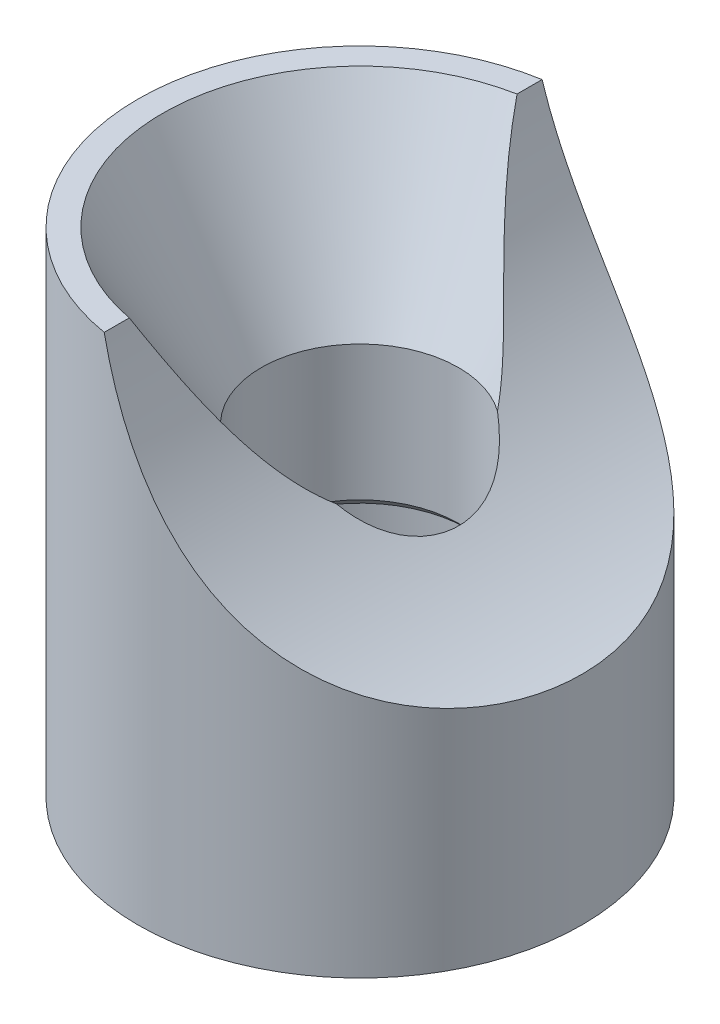
ISO-10303-21;
HEADER;
FILE_DESCRIPTION(('STEP AP214'),'2;1');
FILE_NAME('part.step','',(''),(''),'','','');
FILE_SCHEMA(('AUTOMOTIVE_DESIGN { 1 0 10303 214 1 1 1 1 }'));
ENDSEC;
DATA;
#1=APPLICATION_CONTEXT('core data for automotive mechanical design processes');
#2=APPLICATION_PROTOCOL_DEFINITION('international standard','automotive_design',2000,#1);
#3=PRODUCT_CONTEXT('',#1,'mechanical');
#4=PRODUCT('Part','Part','',(#3));
#5=PRODUCT_RELATED_PRODUCT_CATEGORY('part','',(#4));
#6=PRODUCT_DEFINITION_FORMATION('','',#4);
#7=PRODUCT_DEFINITION_CONTEXT('part definition',#1,'design');
#8=PRODUCT_DEFINITION('design','',#6,#7);
#9=PRODUCT_DEFINITION_SHAPE('','',#8);
#10=(LENGTH_UNIT() NAMED_UNIT(*) SI_UNIT(.MILLI.,.METRE.));
#11=(NAMED_UNIT(*) PLANE_ANGLE_UNIT() SI_UNIT($,.RADIAN.));
#12=(NAMED_UNIT(*) SI_UNIT($,.STERADIAN.) SOLID_ANGLE_UNIT());
#13=UNCERTAINTY_MEASURE_WITH_UNIT(LENGTH_MEASURE(1.E-05),#10,'distance_accuracy_value','');
#14=(GEOMETRIC_REPRESENTATION_CONTEXT(3) GLOBAL_UNCERTAINTY_ASSIGNED_CONTEXT((#13)) GLOBAL_UNIT_ASSIGNED_CONTEXT((#10,
#11,#12)) REPRESENTATION_CONTEXT('',''));
#15=CARTESIAN_POINT('',(0.,0.,0.));
#16=DIRECTION('',(0.,0.,1.));
#17=DIRECTION('',(1.,0.,0.));
#18=AXIS2_PLACEMENT_3D('',#15,#16,#17);
#19=CARTESIAN_POINT('',(0.,10.,0.));
#20=DIRECTION('',(0.,-1.,0.));
#21=DIRECTION('',(0.,0.,-1.));
#22=AXIS2_PLACEMENT_3D('',#19,#20,#21);
#23=CYLINDRICAL_SURFACE('',#22,2.);
#24=CARTESIAN_POINT('',(0.,3.8,0.));
#25=DIRECTION('',(0.,-1.,0.));
#26=DIRECTION('',(0.,0.,-1.));
#27=AXIS2_PLACEMENT_3D('',#24,#25,#26);
#28=CIRCLE('',#27,2.);
#29=CARTESIAN_POINT('',(0.,3.8,-2.));
#30=VERTEX_POINT('',#29);
#31=EDGE_CURVE('E47',#30,#30,#28,.T.);
#32=ORIENTED_EDGE('',*,*,#31,.T.);
#33=EDGE_LOOP('',(#32));
#34=FACE_BOUND('',#33,.T.);
#35=CARTESIAN_POINT('',(1.15674803388994,6.53589838486225,-1.6315434367775));
#36=CARTESIAN_POINT('',(1.19425894626913,6.49578044571187,-1.60494081586927));
#37=CARTESIAN_POINT('',(1.23158288819977,6.4567003115364,-1.57653922318807));
#38=CARTESIAN_POINT('',(1.30551440955024,6.38077929045454,-1.51589304636966));
#39=CARTESIAN_POINT('',(1.3421208919373,6.3439416750476,-1.4836430416981));
#40=CARTESIAN_POINT('',(1.45055177123534,6.23684766301907,-1.38052739968841));
#41=CARTESIAN_POINT('',(1.52060056378355,6.17041997460679,-1.30356054965393));
#42=CARTESIAN_POINT('',(1.63991208941856,6.06073416114324,-1.14827676496854));
#43=CARTESIAN_POINT('',(1.69066974224883,6.01545568701804,-1.07253323726487));
#44=CARTESIAN_POINT('',(1.7829017819061,5.93488441889436,-0.910974014105025));
#45=CARTESIAN_POINT('',(1.82440045137315,5.89956543926225,-0.825185586457263));
#46=CARTESIAN_POINT('',(1.89578251445454,5.83971018779863,-0.644589591116182));
#47=CARTESIAN_POINT('',(1.92558443366799,5.81524940013042,-0.549724291838569));
#48=CARTESIAN_POINT('',(1.97091322422281,5.77833127636493,-0.354325483817949));
#49=CARTESIAN_POINT('',(1.98643750087338,5.76587612204411,-0.25379094832058));
#50=CARTESIAN_POINT('',(2.00111586352425,5.75410321347232,-0.0616989108518325));
#51=CARTESIAN_POINT('',(2.00184706612902,5.75351975320392,0.0296649899641201));
#52=CARTESIAN_POINT('',(1.99089812518495,5.76229620382802,0.211137506092576));
#53=CARTESIAN_POINT('',(1.97922213338188,5.77165278854203,0.301246531097703));
#54=CARTESIAN_POINT('',(1.94477522887524,5.79958331123451,0.47480250231309));
#55=CARTESIAN_POINT('',(1.92236245328382,5.81786005429942,0.55836964300246));
#56=CARTESIAN_POINT('',(1.86792606454922,5.86297635880405,0.719798166824294));
#57=CARTESIAN_POINT('',(1.8359055105991,5.88981319481329,0.797661356336512));
#58=CARTESIAN_POINT('',(1.76187513242622,5.95313788708294,0.950479597415343));
#59=CARTESIAN_POINT('',(1.71939937655639,5.99008925973467,1.02501483188785));
#60=CARTESIAN_POINT('',(1.62769178713785,6.07192375178374,1.16518625811337));
#61=CARTESIAN_POINT('',(1.57844632810686,6.11682292163192,1.23080395787933));
#62=CARTESIAN_POINT('',(1.46908881012858,6.21940487786976,1.36006910951232));
#63=CARTESIAN_POINT('',(1.40838356043583,6.27797827606618,1.42250644684763));
#64=CARTESIAN_POINT('',(1.31516889882843,6.37108997595746,1.50734598395712));
#65=CARTESIAN_POINT('',(1.28380490188773,6.40293129712385,1.53411014686877));
#66=CARTESIAN_POINT('',(1.22058856655047,6.46823091676681,1.58486618602778));
#67=CARTESIAN_POINT('',(1.18873665317954,6.50168785710217,1.60886033521973));
#68=CARTESIAN_POINT('',(1.15674803388994,6.53589838486225,1.6315434367775));
#69=B_SPLINE_CURVE_WITH_KNOTS('',3,(#35,#36,#37,#38,#39,#40,#41,#42,#43,#44,#45,#46,#47,#48,#49,
#50,#51,#52,#53,#54,#55,#56,#57,#58,#59,#60,#61,#62,#63,#64,#65,#66,#67,#68),.UNSPECIFIED.,.F.,
.F.,(4,2,2,2,2,2,2,2,2,2,2,2,2,2,2,2,4),(0.,0.183003697788276,0.366268270436999,
0.734646269525449,1.0388186425176,1.34218366190145,1.64762579894021,1.95312343333355,
2.22585685361206,2.49849903945644,2.76262073047797,3.02665841213508,3.30577032928311,
3.58545247644377,3.89914822082034,4.05535184815806,4.21142637707271),.UNSPECIFIED.);
#70=CARTESIAN_POINT('',(1.15674803388994,6.53589838486225,-1.6315434367775));
#71=VERTEX_POINT('',#70);
#72=CARTESIAN_POINT('',(1.15674803388994,6.53589838486225,1.6315434367775));
#73=VERTEX_POINT('',#72);
#74=EDGE_CURVE('E54',#71,#73,#69,.T.);
#75=ORIENTED_EDGE('',*,*,#74,.F.);
#76=CARTESIAN_POINT('',(0.,6.53589838486225,0.));
#77=DIRECTION('',(0.,1.,0.));
#78=DIRECTION('',(0.,0.,1.));
#79=AXIS2_PLACEMENT_3D('',#76,#77,#78);
#80=CIRCLE('',#79,2.);
#81=EDGE_CURVE('E91',#71,#73,#80,.T.);
#82=ORIENTED_EDGE('',*,*,#81,.T.);
#83=EDGE_LOOP('',(#75,#82));
#84=FACE_BOUND('',#83,.T.);
#85=ADVANCED_FACE('F38',(#34,#84),#23,.F.);
#86=CARTESIAN_POINT('',(0.,10.,0.));
#87=DIRECTION('',(0.,1.,0.));
#88=DIRECTION('',(0.,0.,1.));
#89=AXIS2_PLACEMENT_3D('',#86,#87,#88);
#90=PLANE('',#89);
#91=DIRECTION('',(0.,0.,1.));
#92=VECTOR('',#91,1.);
#93=CARTESIAN_POINT('',(-0.745966692414835,10.,-4.5));
#94=LINE('',#93,#92);
#95=CARTESIAN_POINT('',(-0.745966692414835,10.,-4.43773970550411));
#96=VERTEX_POINT('',#95);
#97=CARTESIAN_POINT('',(-0.745966692414835,10.,-3.92982616585107));
#98=VERTEX_POINT('',#97);
#99=EDGE_CURVE('E88',#96,#98,#94,.T.);
#100=ORIENTED_EDGE('',*,*,#99,.F.);
#101=CARTESIAN_POINT('',(0.,10.,0.));
#102=DIRECTION('',(0.,1.,0.));
#103=DIRECTION('',(0.,0.,1.));
#104=AXIS2_PLACEMENT_3D('',#101,#102,#103);
#105=CIRCLE('',#104,4.5);
#106=CARTESIAN_POINT('',(-0.745966692414835,10.,4.43773970550411));
#107=VERTEX_POINT('',#106);
#108=EDGE_CURVE('E86',#96,#107,#105,.T.);
#109=ORIENTED_EDGE('',*,*,#108,.T.);
#110=CARTESIAN_POINT('',(-0.745966692414836,10.,3.92982616585107));
#111=VERTEX_POINT('',#110);
#112=EDGE_CURVE('E73',#111,#107,#94,.T.);
#113=ORIENTED_EDGE('',*,*,#112,.F.);
#114=CARTESIAN_POINT('',(0.,10.,0.));
#115=DIRECTION('',(0.,1.,0.));
#116=DIRECTION('',(0.,0.,1.));
#117=AXIS2_PLACEMENT_3D('',#114,#115,#116);
#118=CIRCLE('',#117,4.);
#119=EDGE_CURVE('E80',#111,#98,#118,.F.);
#120=ORIENTED_EDGE('',*,*,#119,.T.);
#121=EDGE_LOOP('',(#100,#109,#113,#120));
#122=FACE_BOUND('',#121,.T.);
#123=ADVANCED_FACE('F84',(#122),#90,.T.);
#124=CARTESIAN_POINT('',(0.,0.,0.));
#125=DIRECTION('',(0.,1.,0.));
#126=DIRECTION('',(0.,0.,1.));
#127=AXIS2_PLACEMENT_3D('',#124,#125,#126);
#128=PLANE('',#127);
#129=CARTESIAN_POINT('',(0.,0.,0.));
#130=DIRECTION('',(0.,1.,0.));
#131=DIRECTION('',(0.,0.,1.));
#132=AXIS2_PLACEMENT_3D('',#129,#130,#131);
#133=CIRCLE('',#132,2.45);
#134=CARTESIAN_POINT('',(0.,0.,2.45));
#135=VERTEX_POINT('',#134);
#136=EDGE_CURVE('E161',#135,#135,#133,.T.);
#137=ORIENTED_EDGE('',*,*,#136,.T.);
#138=EDGE_LOOP('',(#137));
#139=FACE_BOUND('',#138,.T.);
#140=CARTESIAN_POINT('',(0.,0.,0.));
#141=DIRECTION('',(0.,1.,0.));
#142=DIRECTION('',(0.,0.,1.));
#143=AXIS2_PLACEMENT_3D('',#140,#141,#142);
#144=CIRCLE('',#143,4.5);
#145=CARTESIAN_POINT('',(0.,0.,4.5));
#146=VERTEX_POINT('',#145);
#147=EDGE_CURVE('E151',#146,#146,#144,.T.);
#148=ORIENTED_EDGE('',*,*,#147,.F.);
#149=EDGE_LOOP('',(#148));
#150=FACE_BOUND('',#149,.T.);
#151=ADVANCED_FACE('F138',(#139,#150),#128,.F.);
#152=CARTESIAN_POINT('',(0.,10.,0.));
#153=DIRECTION('',(0.,-1.,0.));
#154=DIRECTION('',(0.,0.,-1.));
#155=AXIS2_PLACEMENT_3D('',#152,#153,#154);
#156=CYLINDRICAL_SURFACE('',#155,4.5);
#157=ORIENTED_EDGE('',*,*,#108,.F.);
#158=CARTESIAN_POINT('',(-0.745966692414835,10.,-4.43773970550411));
#159=CARTESIAN_POINT('',(-0.698689585190263,9.81685972457877,-4.44564197057178));
#160=CARTESIAN_POINT('',(-0.644903152346768,9.63541282795012,-4.45395042737892));
#161=CARTESIAN_POINT('',(-0.524572984025331,9.27666090320863,-4.46974419286657));
#162=CARTESIAN_POINT('',(-0.458022754346494,9.0993580353129,-4.47722907945177));
#163=CARTESIAN_POINT('',(-0.311910870766016,8.74848274876254,-4.48977722525432));
#164=CARTESIAN_POINT('',(-0.232252325549187,8.57494991735968,-4.49482125671741));
#165=CARTESIAN_POINT('',(-0.0607057298173962,8.23398965766239,-4.50040945631085));
#166=CARTESIAN_POINT('',(0.0311793583682647,8.06656076294402,-4.50095471242496));
#167=CARTESIAN_POINT('',(0.21448246116907,7.75916598845635,-4.49570020995287));
#168=CARTESIAN_POINT('',(0.304537479187236,7.61837419077006,-4.49068109625246));
#169=CARTESIAN_POINT('',(0.493081082973053,7.34297965095663,-4.47390504218596));
#170=CARTESIAN_POINT('',(0.591568130012007,7.20837578647863,-4.46214932893638));
#171=CARTESIAN_POINT('',(0.795909332547273,6.94661148862352,-4.43025790501295));
#172=CARTESIAN_POINT('',(0.901738181450145,6.81942802105506,-4.41014989470159));
#173=CARTESIAN_POINT('',(1.12000135147366,6.57296733909042,-4.35983124961911));
#174=CARTESIAN_POINT('',(1.23243395592431,6.45368808697354,-4.32962323088402));
#175=CARTESIAN_POINT('',(1.43821826052689,6.24821282835703,-4.26504152456233));
#176=CARTESIAN_POINT('',(1.53059781735917,6.16034219255014,-4.23288727071098));
#177=CARTESIAN_POINT('',(1.71766104540851,5.99060457424439,-4.16049192755883));
#178=CARTESIAN_POINT('',(1.81234415877006,5.90873615707999,-4.1202527793878));
#179=CARTESIAN_POINT('',(2.00295021996118,5.7514189732214,-4.03103722915363));
#180=CARTESIAN_POINT('',(2.09887324659139,5.6759706168772,-3.98206026921581));
#181=CARTESIAN_POINT('',(2.2906927141143,5.53186156149198,-3.87489274565477));
#182=CARTESIAN_POINT('',(2.38658915473938,5.46320092846575,-3.816702092437));
#183=CARTESIAN_POINT('',(2.57755397081091,5.33250843971558,-3.69044673452948));
#184=CARTESIAN_POINT('',(2.6726132874185,5.27052120244915,-3.62232197191224));
#185=CARTESIAN_POINT('',(2.85977137978645,5.15378395060727,-3.47646101496066));
#186=CARTESIAN_POINT('',(2.95187010697482,5.0990340547232,-3.39872466303804));
#187=CARTESIAN_POINT('',(3.13156707325439,4.99672079785609,-3.23390619316007));
#188=CARTESIAN_POINT('',(3.21916592175656,4.94915646204239,-3.14682534567432));
#189=CARTESIAN_POINT('',(3.38841176804792,4.86098475109408,-2.96381431594502));
#190=CARTESIAN_POINT('',(3.47005928467275,4.82037676908852,-2.86788490677273));
#191=CARTESIAN_POINT('',(3.61778940098388,4.74971514946311,-2.67851758513476));
#192=CARTESIAN_POINT('',(3.68460427020164,4.71899877914846,-2.58589567762614));
#193=CARTESIAN_POINT('',(3.81161125857341,4.66249283056637,-2.39474210747643));
#194=CARTESIAN_POINT('',(3.87180111669079,4.63670493212973,-2.29620844484226));
#195=CARTESIAN_POINT('',(3.98479019413709,4.58971968219156,-2.09400487293283));
#196=CARTESIAN_POINT('',(4.03759243621458,4.56852045121733,-1.99033708800423));
#197=CARTESIAN_POINT('',(4.13526428013754,4.5303251922797,-1.77853715984164));
#198=CARTESIAN_POINT('',(4.18013088692586,4.51333075032119,-1.67040334995843));
#199=CARTESIAN_POINT('',(4.26098508892248,4.48337599083227,-1.45170534917217));
#200=CARTESIAN_POINT('',(4.29706516125289,4.47037324440538,-1.34118112111149));
#201=CARTESIAN_POINT('',(4.36064029499012,4.44785335156776,-1.11730138541944));
#202=CARTESIAN_POINT('',(4.38813226552587,4.43833745986877,-1.00394487426027));
#203=CARTESIAN_POINT('',(4.43425112908907,4.42256460383622,-0.775254732230523));
#204=CARTESIAN_POINT('',(4.45288056785305,4.41630670360525,-0.659921678989744));
#205=CARTESIAN_POINT('',(4.48112434667666,4.4068789470133,-0.427992007475124));
#206=CARTESIAN_POINT('',(4.49073551481435,4.4037101771514,-0.311394959201346));
#207=CARTESIAN_POINT('',(4.50095580510215,4.40034153978682,-0.0752489433103101));
#208=CARTESIAN_POINT('',(4.5013668612639,4.40020699458103,0.0443095762279297));
#209=CARTESIAN_POINT('',(4.49267784618044,4.40306929232996,0.283043139502806));
#210=CARTESIAN_POINT('',(4.4835777174428,4.40606615421316,0.402218180917058));
#211=CARTESIAN_POINT('',(4.4559457000376,4.41527854378294,0.639377263290128));
#212=CARTESIAN_POINT('',(4.43741130421408,4.42149492706485,0.757360979149965));
#213=CARTESIAN_POINT('',(4.39109091378513,4.43731586292269,0.991223759667032));
#214=CARTESIAN_POINT('',(4.36330824983904,4.44691919580094,1.10710356620263));
#215=CARTESIAN_POINT('',(4.29861585561261,4.46981372577492,1.33647394653303));
#216=CARTESIAN_POINT('',(4.26166634122268,4.48312102963212,1.44995170171385));
#217=CARTESIAN_POINT('',(4.17909852343794,4.51371581341377,1.67310585493509));
#218=CARTESIAN_POINT('',(4.13348359188357,4.53100174574748,1.78278371200887));
#219=CARTESIAN_POINT('',(4.0340630574231,4.56992150730432,1.99758422399148));
#220=CARTESIAN_POINT('',(3.98025614669204,4.59155603094394,2.10270614811062));
#221=CARTESIAN_POINT('',(3.86510127796229,4.63954506710561,2.30755086056224));
#222=CARTESIAN_POINT('',(3.80375639186903,4.66589765888972,2.40727582457643));
#223=CARTESIAN_POINT('',(3.67541056760069,4.72319072895806,2.59892691250728));
#224=CARTESIAN_POINT('',(3.60852931008018,4.75404149897586,2.69096002354309));
#225=CARTESIAN_POINT('',(3.4690585928969,4.82097285926463,2.86851382547387));
#226=CARTESIAN_POINT('',(3.39647126988217,4.85705149617751,2.95403693066429));
#227=CARTESIAN_POINT('',(3.24650988419578,4.93470182447883,3.11809625188039));
#228=CARTESIAN_POINT('',(3.16913609240295,4.97627320516945,3.196632862678));
#229=CARTESIAN_POINT('',(3.01061936396516,5.06508161419709,3.34634982869794));
#230=CARTESIAN_POINT('',(2.92947644208599,5.11231862033981,3.41753021273524));
#231=CARTESIAN_POINT('',(2.76544640981551,5.21194758421937,3.55153394194227));
#232=CARTESIAN_POINT('',(2.68259033103329,5.26427359449197,3.61444442941012));
#233=CARTESIAN_POINT('',(2.51524778617484,5.37451589931491,3.73283254308252));
#234=CARTESIAN_POINT('',(2.43076069355352,5.43243437780195,3.78830724514838));
#235=CARTESIAN_POINT('',(2.26120848642598,5.55370523205879,3.8918897063549));
#236=CARTESIAN_POINT('',(2.17614346537811,5.61705674763082,3.93999862835203));
#237=CARTESIAN_POINT('',(2.00635094678355,5.74899754907165,4.029113021918));
#238=CARTESIAN_POINT('',(1.92162349055934,5.81758745664571,4.07011764843806));
#239=CARTESIAN_POINT('',(1.74729406478283,5.9648514923397,4.14809919737278));
#240=CARTESIAN_POINT('',(1.65778055163949,6.0438961197035,4.18457329382987));
#241=CARTESIAN_POINT('',(1.48101817112148,6.20730365152492,4.25035068798773));
#242=CARTESIAN_POINT('',(1.39376937000262,6.29166671133012,4.27965377610636));
#243=CARTESIAN_POINT('',(1.22222714231204,6.46535927835004,4.33176667885237));
#244=CARTESIAN_POINT('',(1.13793560944249,6.55469187648287,4.35457239707955));
#245=CARTESIAN_POINT('',(0.972957440849544,6.73787444669696,4.39437785606111));
#246=CARTESIAN_POINT('',(0.892271551042507,6.83172534523463,4.41137640024687));
#247=CARTESIAN_POINT('',(0.691618686703616,7.07645275343368,4.44826466499445));
#248=CARTESIAN_POINT('',(0.574522127365065,7.23024034193709,4.46458091271518));
#249=CARTESIAN_POINT('',(0.351465675809646,7.54640857911453,4.48765604835781));
#250=CARTESIAN_POINT('',(0.245511621772097,7.70879366616766,4.49440994890241));
#251=CARTESIAN_POINT('',(0.045486448825819,8.04115989893025,4.50088438475185));
#252=CARTESIAN_POINT('',(-0.0485669537544893,8.21115187130607,4.50059455516118));
#253=CARTESIAN_POINT('',(-0.223991590177647,8.5573840578893,4.49527737847329));
#254=CARTESIAN_POINT('',(-0.30536762845871,8.73362187382716,4.49025183122202));
#255=CARTESIAN_POINT('',(-0.454255219199045,9.08952310338364,4.47763382294435));
#256=CARTESIAN_POINT('',(-0.521906931155091,9.26912901508334,4.47006965192857));
#257=CARTESIAN_POINT('',(-0.64386930667594,9.63192683676511,4.45410912135303));
#258=CARTESIAN_POINT('',(-0.698235556320961,9.81510021862118,4.4457164428485));
#259=CARTESIAN_POINT('',(-0.745966692414837,10.,4.43773970550411));
#260=B_SPLINE_CURVE_WITH_KNOTS('',3,(#158,#159,#160,#161,#162,#163,#164,#165,#166,#167,#168,
#169,#170,#171,#172,#173,#174,#175,#176,#177,#178,#179,#180,#181,#182,#183,#184,#185,#186,#187,
#188,#189,#190,#191,#192,#193,#194,#195,#196,#197,#198,#199,#200,#201,#202,#203,#204,#205,#206,
#207,#208,#209,#210,#211,#212,#213,#214,#215,#216,#217,#218,#219,#220,#221,#222,#223,#224,#225,
#226,#227,#228,#229,#230,#231,#232,#233,#234,#235,#236,#237,#238,#239,#240,#241,#242,#243,#244,
#245,#246,#247,#248,#249,#250,#251,#252,#253,#254,#255,#256,#257,#258,#259),.UNSPECIFIED.,.F.,
.F.,(4,2,2,2,2,2,2,2,2,2,2,2,2,2,2,2,2,2,2,2,2,2,2,2,2,2,2,2,2,2,2,2,2,2,2,2,2,2,2,2,2,2,2,2,2,
2,2,2,2,2,4),(0.,0.567817690989346,1.13592505690223,1.70843762370105,2.28081173001081,
2.78200433546522,3.28310567435307,3.78255821647273,4.28188149385306,4.67597791975765,
5.06997983853697,5.46400692178756,5.85803783681831,6.25455808713269,6.6510848395172,
7.0475577486066,7.44399605184267,7.79836214990261,8.15284881628435,8.5071900125371,
8.86166465973013,9.21222944544842,9.56292025500053,9.91351026871989,10.2642235464006,
10.6224801110458,10.980738841264,11.3390928284657,11.6973178978993,12.0571257272016,
12.416793835738,12.7765194245385,13.1360988997302,13.4892977553671,13.8423649792535,
14.1954122403852,14.5484581185488,14.8974203127335,15.2465193369422,15.5955631909476,
15.9446485349052,16.3188772758479,16.6931169528121,17.0675920573464,17.4421442760287,
18.0232103376725,18.60457935103,19.186803904467,19.7688072681888,20.3445290935277,
20.9177992039817),.UNSPECIFIED.);
#261=EDGE_CURVE('E61',#96,#107,#260,.T.);
#262=ORIENTED_EDGE('',*,*,#261,.T.);
#263=EDGE_LOOP('',(#157,#262));
#264=FACE_BOUND('',#263,.T.);
#265=ORIENTED_EDGE('',*,*,#147,.T.);
#266=EDGE_LOOP('',(#265));
#267=FACE_BOUND('',#266,.T.);
#268=ADVANCED_FACE('F140',(#264,#267),#156,.T.);
#269=CARTESIAN_POINT('',(0.,6.53589838486225,0.));
#270=DIRECTION('',(0.,1.,0.));
#271=DIRECTION('',(0.,0.,1.));
#272=AXIS2_PLACEMENT_3D('',#269,#270,#271);
#273=CONICAL_SURFACE('',#272,2.,0.5235987755983);
#274=CARTESIAN_POINT('',(-0.82727935121716,10.3466101615138,-4.117836669519));
#275=CARTESIAN_POINT('',(-0.805761607116676,10.244732684827,-4.06215311907708));
#276=CARTESIAN_POINT('',(-0.782195882221287,10.143017456873,-4.00696280504015));
#277=CARTESIAN_POINT('',(-0.730966483020447,9.94012239268277,-3.89750787787031));
#278=CARTESIAN_POINT('',(-0.703302807800184,9.83894255656599,-3.84324326494405));
#279=CARTESIAN_POINT('',(-0.643875465030565,9.63732899646039,-3.73557887567227));
#280=CARTESIAN_POINT('',(-0.612111788553239,9.53689527409678,-3.68217910121027));
#281=CARTESIAN_POINT('',(-0.544513671091163,9.33702389573231,-3.57609992572033));
#282=CARTESIAN_POINT('',(-0.508679270508705,9.23758622985616,-3.52342051754852));
#283=CARTESIAN_POINT('',(-0.432879820885213,9.03966862205692,-3.41838847605034));
#284=CARTESIAN_POINT('',(-0.392901936311074,8.94119275672057,-3.36603742518716));
#285=CARTESIAN_POINT('',(-0.309017115385529,8.74583835392783,-3.26150309141523));
#286=CARTESIAN_POINT('',(-0.265110169450664,8.64895982036819,-3.20931980891602));
#287=CARTESIAN_POINT('',(-0.173544302229269,8.45718370811985,-3.10469236045052));
#288=CARTESIAN_POINT('',(-0.125886617353219,8.36228548957367,-3.05224828574919));
#289=CARTESIAN_POINT('',(-0.0270453120509978,8.17483853648377,-2.94651023734171));
#290=CARTESIAN_POINT('',(0.0241380445620452,8.08228962685752,-2.89321632745445));
#291=CARTESIAN_POINT('',(0.136651027526479,7.88798867880257,-2.77794844665173));
#292=CARTESIAN_POINT('',(0.198430002989232,7.7866259395688,-2.71575431331347));
#293=CARTESIAN_POINT('',(0.325433406265618,7.58819333214219,-2.58808800218965));
#294=CARTESIAN_POINT('',(0.390658011943069,7.4911236860354,-2.52261565519146));
#295=CARTESIAN_POINT('',(0.523558086040785,7.30223416186296,-2.38693454153501));
#296=CARTESIAN_POINT('',(0.591231240048285,7.21040952746642,-2.31673019613537));
#297=CARTESIAN_POINT('',(0.727691753127629,7.03303954853209,-2.16987899679729));
#298=CARTESIAN_POINT('',(0.796478635002434,6.94749159722778,-2.09323484606809));
#299=CARTESIAN_POINT('',(0.958893325345082,6.75345231264913,-1.90148061644932));
#300=CARTESIAN_POINT('',(1.05225863104863,6.64824027299044,-1.7826565004932));
#301=CARTESIAN_POINT('',(1.18572444980447,6.50468133854511,-1.58984228647624));
#302=CARTESIAN_POINT('',(1.22903474354764,6.45928268047134,-1.52329097890187));
#303=CARTESIAN_POINT('',(1.3123453570788,6.37380055398968,-1.38494067017002));
#304=CARTESIAN_POINT('',(1.35234868471691,6.33371223511476,-1.31314655210899));
#305=CARTESIAN_POINT('',(1.41000261107895,6.27700078109692,-1.19923520627079));
#306=CARTESIAN_POINT('',(1.42932196233076,6.25820479425427,-1.15902989207555));
#307=CARTESIAN_POINT('',(1.46648657129119,6.22237977356149,-1.07706299130873));
#308=CARTESIAN_POINT('',(1.48432871677342,6.20535445181161,-1.03529837515157));
#309=CARTESIAN_POINT('',(1.50130664169339,6.18928822334864,-0.992805463697285));
#310=B_SPLINE_CURVE_WITH_KNOTS('',3,(#274,#275,#276,#277,#278,#279,#280,#281,#282,#283,#284,
#285,#286,#287,#288,#289,#290,#291,#292,#293,#294,#295,#296,#297,#298,#299,#300,#301,#302,#303,
#304,#305,#306,#307,#308,#309),.UNSPECIFIED.,.F.,.F.,(4,2,2,2,2,2,2,2,2,2,2,2,2,2,2,2,2,4),(0.,
0.354219660086229,0.708439399247281,1.06265990975349,1.41687690489731,1.77222597829376,
2.12757591845347,2.48280920619026,2.8380159419325,3.23991198212662,3.64182878854982,
4.04337514164651,4.44475377348695,4.99520596932692,5.26932144292964,5.54318478698987,
5.68832706230673,5.83376773374887),.UNSPECIFIED.);
#311=EDGE_CURVE('E79',#98,#71,#310,.T.);
#312=ORIENTED_EDGE('',*,*,#311,.F.);
#313=ORIENTED_EDGE('',*,*,#119,.F.);
#314=CARTESIAN_POINT('',(1.50130664169339,6.18928822334864,0.992805463697285));
#315=CARTESIAN_POINT('',(1.47438522620426,6.21475845435075,1.06019546421583));
#316=CARTESIAN_POINT('',(1.44529577227451,6.2426450416684,1.12572656372318));
#317=CARTESIAN_POINT('',(1.38367997699814,6.30273941347986,1.25290159682855));
#318=CARTESIAN_POINT('',(1.35116088714056,6.33493811803112,1.31455330875682));
#319=CARTESIAN_POINT('',(1.28404423587204,6.40267146179241,1.43305975141989));
#320=CARTESIAN_POINT('',(1.2494916323416,6.43813977048785,1.48997840460916));
#321=CARTESIAN_POINT('',(1.17849913641133,6.51248909985985,1.60034587596005));
#322=CARTESIAN_POINT('',(1.14205806104014,6.55137227052159,1.65379247075483));
#323=CARTESIAN_POINT('',(1.04015525682359,6.66245262774429,1.7962286750446));
#324=CARTESIAN_POINT('',(0.973401580939793,6.73778749779451,1.88185459387481));
#325=CARTESIAN_POINT('',(0.838742530933845,6.89610576420708,2.04467870193517));
#326=CARTESIAN_POINT('',(0.770836474269544,6.97909383235673,2.12187167974933));
#327=CARTESIAN_POINT('',(0.634655439604715,7.15285825303537,2.27083653293718));
#328=CARTESIAN_POINT('',(0.566394238695099,7.24374409608676,2.34249219227771));
#329=CARTESIAN_POINT('',(0.432150616340635,7.43090528589791,2.4806339845884));
#330=CARTESIAN_POINT('',(0.366168013899637,7.52718020298719,2.54712052868483));
#331=CARTESIAN_POINT('',(0.234349367146917,7.72902778722244,2.67966674222075));
#332=CARTESIAN_POINT('',(0.168677887914879,7.83482490727462,2.74554695305294));
#333=CARTESIAN_POINT('',(0.0417638961437432,8.05049184465632,2.87490124780903));
#334=CARTESIAN_POINT('',(-0.0194777553803338,8.16036244749536,2.93837486283395));
#335=CARTESIAN_POINT('',(-0.137000626721947,8.38349110607159,3.06417881344162));
#336=CARTESIAN_POINT('',(-0.193278087000946,8.49675164363636,3.12650825469245));
#337=CARTESIAN_POINT('',(-0.300441699339923,8.72592685315761,3.25092189190087));
#338=CARTESIAN_POINT('',(-0.351327847276322,8.84184152714404,3.31300608767083));
#339=CARTESIAN_POINT('',(-0.445807533296214,9.07171424254284,3.43546886747961));
#340=CARTESIAN_POINT('',(-0.489592097977083,9.18560182226341,3.49583240023066));
#341=CARTESIAN_POINT('',(-0.57178332475994,9.41486390337508,3.61739732367558));
#342=CARTESIAN_POINT('',(-0.610189910514809,9.53023842584981,3.67859872625051));
#343=CARTESIAN_POINT('',(-0.68154964532386,9.76203374007659,3.80208699010156));
#344=CARTESIAN_POINT('',(-0.714504630601464,9.87845416555778,3.86437347805101));
#345=CARTESIAN_POINT('',(-0.774973695517127,10.1120494553323,3.99016410346037));
#346=CARTESIAN_POINT('',(-0.802487721651033,10.2292243270329,4.05366825288753));
#347=CARTESIAN_POINT('',(-0.827279351217161,10.3466101615138,4.117836669519));
#348=B_SPLINE_CURVE_WITH_KNOTS('',3,(#314,#315,#316,#317,#318,#319,#320,#321,#322,#323,#324,
#325,#326,#327,#328,#329,#330,#331,#332,#333,#334,#335,#336,#337,#338,#339,#340,#341,#342,#343,
#344,#345,#346,#347),.UNSPECIFIED.,.F.,.F.,(4,2,2,2,2,2,2,2,2,2,2,2,2,2,2,2,4),(0.,
0.230534290079846,0.460590564995235,0.686719577333104,0.912991994575487,1.30875167939075,
1.70475456979916,2.10757539183486,2.51036414261601,2.93282606571431,3.3553698823011,
3.77823100537318,4.20109245187092,4.60936531320914,5.01764396990241,5.42578482778841,
5.83392969896403),.UNSPECIFIED.);
#349=EDGE_CURVE('E70',#73,#111,#348,.T.);
#350=ORIENTED_EDGE('',*,*,#349,.F.);
#351=ORIENTED_EDGE('',*,*,#81,.F.);
#352=EDGE_LOOP('',(#312,#313,#350,#351));
#353=FACE_BOUND('',#352,.T.);
#354=ADVANCED_FACE('F90',(#353),#273,.F.);
#355=CARTESIAN_POINT('',(0.,3.6,0.));
#356=DIRECTION('',(0.,-1.,0.));
#357=DIRECTION('',(0.,0.,-1.));
#358=AXIS2_PLACEMENT_3D('',#355,#356,#357);
#359=CYLINDRICAL_SURFACE('',#358,2.25);
#360=CARTESIAN_POINT('',(0.,0.2,0.));
#361=DIRECTION('',(0.,1.,0.));
#362=DIRECTION('',(0.,0.,1.));
#363=AXIS2_PLACEMENT_3D('',#360,#361,#362);
#364=CIRCLE('',#363,2.25);
#365=CARTESIAN_POINT('',(0.,0.2,2.25));
#366=VERTEX_POINT('',#365);
#367=EDGE_CURVE('E158',#366,#366,#364,.F.);
#368=ORIENTED_EDGE('',*,*,#367,.T.);
#369=EDGE_LOOP('',(#368));
#370=FACE_BOUND('',#369,.T.);
#371=CARTESIAN_POINT('',(0.,3.6,0.));
#372=DIRECTION('',(0.,-1.,0.));
#373=DIRECTION('',(0.,0.,-1.));
#374=AXIS2_PLACEMENT_3D('',#371,#372,#373);
#375=CIRCLE('',#374,2.25);
#376=CARTESIAN_POINT('',(0.,3.6,-2.25));
#377=VERTEX_POINT('',#376);
#378=EDGE_CURVE('E153',#377,#377,#375,.T.);
#379=ORIENTED_EDGE('',*,*,#378,.F.);
#380=EDGE_LOOP('',(#379));
#381=FACE_BOUND('',#380,.T.);
#382=ADVANCED_FACE('F135',(#370,#381),#359,.F.);
#383=CARTESIAN_POINT('',(0.,3.6,0.));
#384=DIRECTION('',(0.,-1.,0.));
#385=DIRECTION('',(0.,0.,-1.));
#386=AXIS2_PLACEMENT_3D('',#383,#384,#385);
#387=PLANE('',#386);
#388=CARTESIAN_POINT('',(0.,3.6,0.));
#389=DIRECTION('',(0.,-1.,0.));
#390=DIRECTION('',(0.,0.,-1.));
#391=AXIS2_PLACEMENT_3D('',#388,#389,#390);
#392=CIRCLE('',#391,2.2);
#393=CARTESIAN_POINT('',(0.,3.6,-2.2));
#394=VERTEX_POINT('',#393);
#395=EDGE_CURVE('E11',#394,#394,#392,.F.);
#396=ORIENTED_EDGE('',*,*,#395,.T.);
#397=EDGE_LOOP('',(#396));
#398=FACE_BOUND('',#397,.T.);
#399=ORIENTED_EDGE('',*,*,#378,.T.);
#400=EDGE_LOOP('',(#399));
#401=FACE_BOUND('',#400,.T.);
#402=ADVANCED_FACE('F114',(#398,#401),#387,.T.);
#403=CARTESIAN_POINT('',(7.,12.,-4.5));
#404=DIRECTION('',(0.,0.,1.));
#405=DIRECTION('',(1.,0.,0.));
#406=AXIS2_PLACEMENT_3D('',#403,#404,#405);
#407=CYLINDRICAL_SURFACE('',#406,8.);
#408=ORIENTED_EDGE('',*,*,#99,.T.);
#409=ORIENTED_EDGE('',*,*,#311,.T.);
#410=ORIENTED_EDGE('',*,*,#74,.T.);
#411=ORIENTED_EDGE('',*,*,#349,.T.);
#412=ORIENTED_EDGE('',*,*,#112,.T.);
#413=ORIENTED_EDGE('',*,*,#261,.F.);
#414=EDGE_LOOP('',(#408,#409,#410,#411,#412,#413));
#415=FACE_BOUND('',#414,.T.);
#416=ADVANCED_FACE('F72',(#415),#407,.F.);
#417=CARTESIAN_POINT('',(0.,0.2,0.));
#418=DIRECTION('',(0.,-1.,0.));
#419=DIRECTION('',(0.,0.,-1.));
#420=AXIS2_PLACEMENT_3D('',#417,#418,#419);
#421=CONICAL_SURFACE('',#420,2.25,0.78539816339745);
#422=ORIENTED_EDGE('',*,*,#136,.F.);
#423=EDGE_LOOP('',(#422));
#424=FACE_BOUND('',#423,.T.);
#425=ORIENTED_EDGE('',*,*,#367,.F.);
#426=EDGE_LOOP('',(#425));
#427=FACE_BOUND('',#426,.T.);
#428=ADVANCED_FACE('F113',(#424,#427),#421,.F.);
#429=CARTESIAN_POINT('',(0.,3.8,0.));
#430=DIRECTION('',(0.,-1.,0.));
#431=DIRECTION('',(0.,0.,-1.));
#432=AXIS2_PLACEMENT_3D('',#429,#430,#431);
#433=CONICAL_SURFACE('',#432,2.,0.78539816339745);
#434=ORIENTED_EDGE('',*,*,#395,.F.);
#435=EDGE_LOOP('',(#434));
#436=FACE_BOUND('',#435,.T.);
#437=ORIENTED_EDGE('',*,*,#31,.F.);
#438=EDGE_LOOP('',(#437));
#439=FACE_BOUND('',#438,.T.);
#440=ADVANCED_FACE('F41',(#436,#439),#433,.F.);
#441=CLOSED_SHELL('',(#85,#123,#151,#268,#354,#382,#402,#416,#428,#440));
#442=MANIFOLD_SOLID_BREP('B2',#441);
#443=ADVANCED_BREP_SHAPE_REPRESENTATION('',(#18,#442),#14);
#444=SHAPE_DEFINITION_REPRESENTATION(#9,#443);
ENDSEC;
END-ISO-10303-21;
